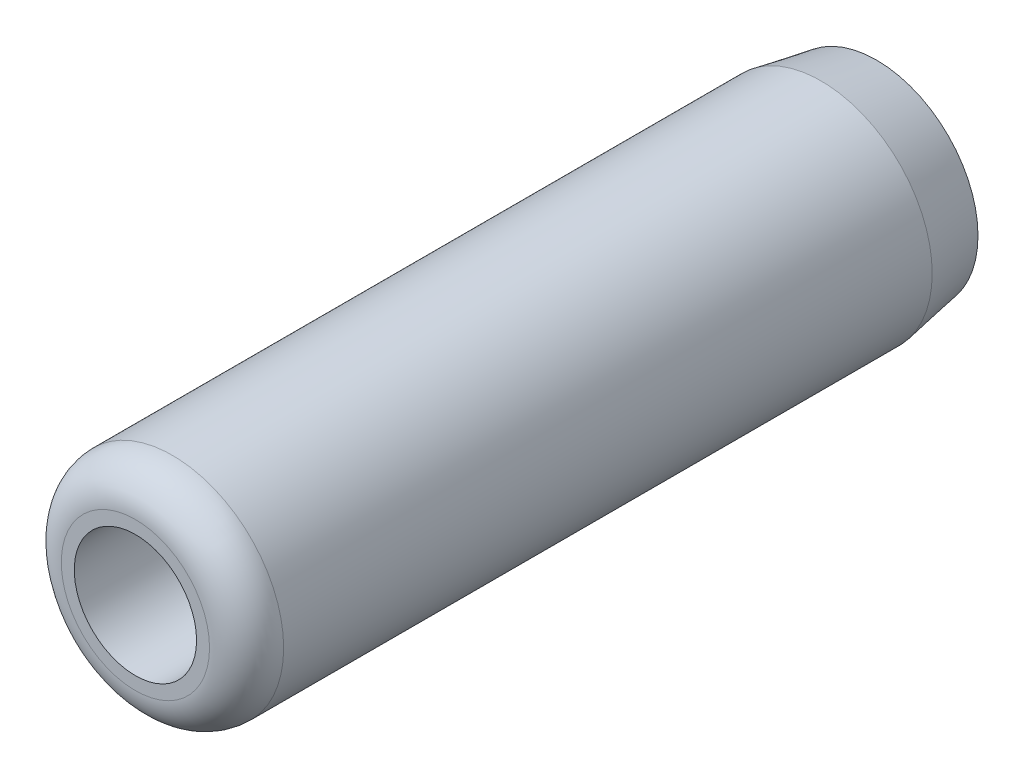
ISO-10303-21;
HEADER;
FILE_DESCRIPTION(('STEP AP214'),'2;1');
FILE_NAME('part.step','',(''),(''),'','','');
FILE_SCHEMA(('AUTOMOTIVE_DESIGN { 1 0 10303 214 1 1 1 1 }'));
ENDSEC;
DATA;
#1=APPLICATION_CONTEXT('core data for automotive mechanical design processes');
#2=APPLICATION_PROTOCOL_DEFINITION('international standard','automotive_design',2000,#1);
#3=PRODUCT_CONTEXT('',#1,'mechanical');
#4=PRODUCT('Part','Part','',(#3));
#5=PRODUCT_RELATED_PRODUCT_CATEGORY('part','',(#4));
#6=PRODUCT_DEFINITION_FORMATION('','',#4);
#7=PRODUCT_DEFINITION_CONTEXT('part definition',#1,'design');
#8=PRODUCT_DEFINITION('design','',#6,#7);
#9=PRODUCT_DEFINITION_SHAPE('','',#8);
#10=(LENGTH_UNIT() NAMED_UNIT(*) SI_UNIT(.MILLI.,.METRE.));
#11=(NAMED_UNIT(*) PLANE_ANGLE_UNIT() SI_UNIT($,.RADIAN.));
#12=(NAMED_UNIT(*) SI_UNIT($,.STERADIAN.) SOLID_ANGLE_UNIT());
#13=UNCERTAINTY_MEASURE_WITH_UNIT(LENGTH_MEASURE(1.E-05),#10,'distance_accuracy_value','');
#14=(GEOMETRIC_REPRESENTATION_CONTEXT(3) GLOBAL_UNCERTAINTY_ASSIGNED_CONTEXT((#13)) GLOBAL_UNIT_ASSIGNED_CONTEXT((#10,
#11,#12)) REPRESENTATION_CONTEXT('',''));
#15=CARTESIAN_POINT('',(0.,0.,0.));
#16=DIRECTION('',(0.,0.,1.));
#17=DIRECTION('',(1.,0.,0.));
#18=AXIS2_PLACEMENT_3D('',#15,#16,#17);
#19=CARTESIAN_POINT('',(0.,0.,0.));
#20=DIRECTION('',(0.,0.,-1.));
#21=DIRECTION('',(-1.,0.,0.));
#22=AXIS2_PLACEMENT_3D('',#19,#20,#21);
#23=PLANE('',#22);
#24=CARTESIAN_POINT('',(0.,0.,0.));
#25=DIRECTION('',(0.,0.,1.));
#26=DIRECTION('',(1.,0.,0.));
#27=AXIS2_PLACEMENT_3D('',#24,#25,#26);
#28=CIRCLE('',#27,1.65);
#29=CARTESIAN_POINT('',(1.65,0.,0.));
#30=VERTEX_POINT('',#29);
#31=EDGE_CURVE('E71',#30,#30,#28,.T.);
#32=ORIENTED_EDGE('',*,*,#31,.F.);
#33=EDGE_LOOP('',(#32));
#34=FACE_BOUND('',#33,.T.);
#35=CARTESIAN_POINT('',(0.,0.,0.));
#36=DIRECTION('',(0.,0.,1.));
#37=DIRECTION('',(1.,0.,0.));
#38=AXIS2_PLACEMENT_3D('',#35,#36,#37);
#39=CIRCLE('',#38,1.99999999999999);
#40=CARTESIAN_POINT('',(1.99999999999999,0.,0.));
#41=VERTEX_POINT('',#40);
#42=EDGE_CURVE('E10',#41,#41,#39,.T.);
#43=ORIENTED_EDGE('',*,*,#42,.T.);
#44=EDGE_LOOP('',(#43));
#45=FACE_BOUND('',#44,.T.);
#46=ADVANCED_FACE('F42',(#34,#45),#23,.F.);
#47=CARTESIAN_POINT('',(0.,0.,-1.));
#48=DIRECTION('',(0.,0.,1.));
#49=DIRECTION('',(1.,0.,0.));
#50=AXIS2_PLACEMENT_3D('',#47,#48,#49);
#51=TOROIDAL_SURFACE('',#50,2.,1.);
#52=ORIENTED_EDGE('',*,*,#42,.F.);
#53=EDGE_LOOP('',(#52));
#54=FACE_BOUND('',#53,.T.);
#55=CARTESIAN_POINT('',(0.,0.,-1.00000000000001));
#56=DIRECTION('',(0.,0.,1.));
#57=DIRECTION('',(1.,0.,0.));
#58=AXIS2_PLACEMENT_3D('',#55,#56,#57);
#59=CIRCLE('',#58,3.);
#60=CARTESIAN_POINT('',(3.,0.,-1.00000000000001));
#61=VERTEX_POINT('',#60);
#62=EDGE_CURVE('E49',#61,#61,#59,.T.);
#63=ORIENTED_EDGE('',*,*,#62,.T.);
#64=EDGE_LOOP('',(#63));
#65=FACE_BOUND('',#64,.T.);
#66=ADVANCED_FACE('F80',(#54,#65),#51,.T.);
#67=CARTESIAN_POINT('',(0.,0.,0.));
#68=DIRECTION('',(0.,0.,1.));
#69=DIRECTION('',(1.,0.,0.));
#70=AXIS2_PLACEMENT_3D('',#67,#68,#69);
#71=CYLINDRICAL_SURFACE('',#70,3.);
#72=ORIENTED_EDGE('',*,*,#62,.F.);
#73=EDGE_LOOP('',(#72));
#74=FACE_BOUND('',#73,.T.);
#75=CARTESIAN_POINT('',(0.,0.,-18.5));
#76=DIRECTION('',(0.,0.,1.));
#77=DIRECTION('',(1.,0.,0.));
#78=AXIS2_PLACEMENT_3D('',#75,#76,#77);
#79=CIRCLE('',#78,3.);
#80=CARTESIAN_POINT('',(3.,0.,-18.5));
#81=VERTEX_POINT('',#80);
#82=EDGE_CURVE('E55',#81,#81,#79,.T.);
#83=ORIENTED_EDGE('',*,*,#82,.T.);
#84=EDGE_LOOP('',(#83));
#85=FACE_BOUND('',#84,.T.);
#86=ADVANCED_FACE('F84',(#74,#85),#71,.T.);
#87=CARTESIAN_POINT('',(0.,0.,-20.));
#88=DIRECTION('',(0.,0.,1.));
#89=DIRECTION('',(1.,0.,0.));
#90=AXIS2_PLACEMENT_3D('',#87,#88,#89);
#91=CONICAL_SURFACE('',#90,2.7355095289373,0.174532925199433);
#92=ORIENTED_EDGE('',*,*,#82,.F.);
#93=EDGE_LOOP('',(#92));
#94=FACE_BOUND('',#93,.T.);
#95=CARTESIAN_POINT('',(0.,0.,-20.));
#96=DIRECTION('',(0.,0.,1.));
#97=DIRECTION('',(1.,0.,0.));
#98=AXIS2_PLACEMENT_3D('',#95,#96,#97);
#99=CIRCLE('',#98,2.7355095289373);
#100=CARTESIAN_POINT('',(2.7355095289373,0.,-20.));
#101=VERTEX_POINT('',#100);
#102=EDGE_CURVE('E61',#101,#101,#99,.T.);
#103=ORIENTED_EDGE('',*,*,#102,.T.);
#104=EDGE_LOOP('',(#103));
#105=FACE_BOUND('',#104,.T.);
#106=ADVANCED_FACE('F89',(#94,#105),#91,.T.);
#107=CARTESIAN_POINT('',(0.,2.7355095289373,-20.));
#108=DIRECTION('',(0.,0.,1.));
#109=DIRECTION('',(1.,0.,0.));
#110=AXIS2_PLACEMENT_3D('',#107,#108,#109);
#111=PLANE('',#110);
#112=CARTESIAN_POINT('',(0.,0.,-20.));
#113=DIRECTION('',(0.,0.,1.));
#114=DIRECTION('',(1.,0.,0.));
#115=AXIS2_PLACEMENT_3D('',#112,#113,#114);
#116=CIRCLE('',#115,1.64999999999999);
#117=CARTESIAN_POINT('',(1.64999999999999,0.,-20.));
#118=VERTEX_POINT('',#117);
#119=EDGE_CURVE('E67',#118,#118,#116,.T.);
#120=ORIENTED_EDGE('',*,*,#119,.T.);
#121=EDGE_LOOP('',(#120));
#122=FACE_BOUND('',#121,.T.);
#123=ORIENTED_EDGE('',*,*,#102,.F.);
#124=EDGE_LOOP('',(#123));
#125=FACE_BOUND('',#124,.T.);
#126=ADVANCED_FACE('F95',(#122,#125),#111,.F.);
#127=CARTESIAN_POINT('',(0.,0.,0.));
#128=DIRECTION('',(0.,0.,1.));
#129=DIRECTION('',(1.,0.,0.));
#130=AXIS2_PLACEMENT_3D('',#127,#128,#129);
#131=CYLINDRICAL_SURFACE('',#130,1.65);
#132=ORIENTED_EDGE('',*,*,#119,.F.);
#133=EDGE_LOOP('',(#132));
#134=FACE_BOUND('',#133,.T.);
#135=ORIENTED_EDGE('',*,*,#31,.T.);
#136=EDGE_LOOP('',(#135));
#137=FACE_BOUND('',#136,.T.);
#138=ADVANCED_FACE('F77',(#134,#137),#131,.F.);
#139=CLOSED_SHELL('',(#46,#66,#86,#106,#126,#138));
#140=MANIFOLD_SOLID_BREP('B2',#139);
#141=ADVANCED_BREP_SHAPE_REPRESENTATION('',(#18,#140),#14);
#142=SHAPE_DEFINITION_REPRESENTATION(#9,#141);
ENDSEC;
END-ISO-10303-21;
